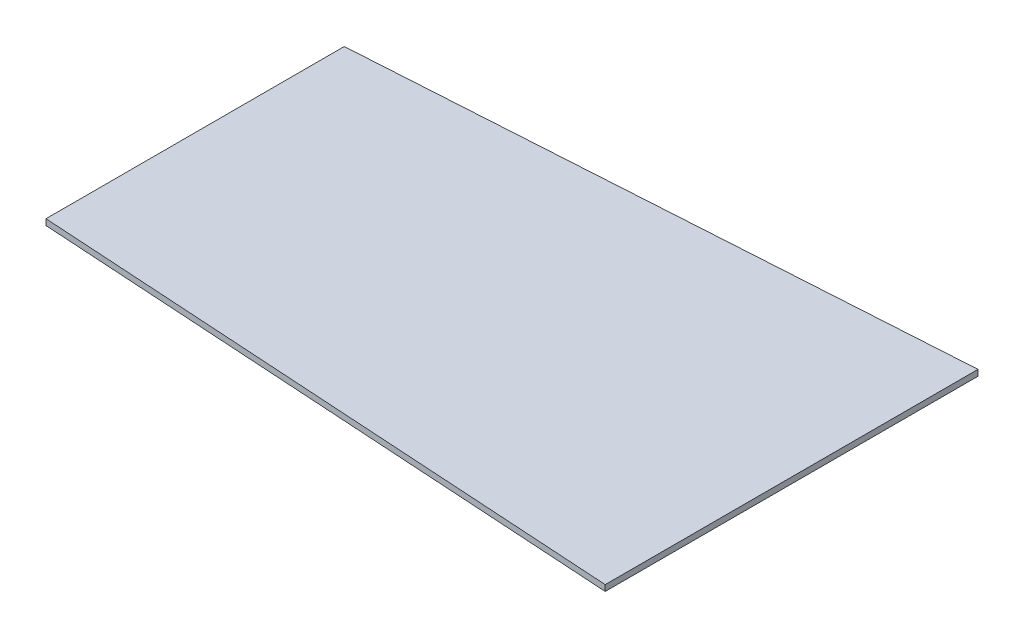
ISO-10303-21;
HEADER;
FILE_DESCRIPTION(('STEP AP214'),'2;1');
FILE_NAME('part.step','',(''),(''),'','','');
FILE_SCHEMA(('AUTOMOTIVE_DESIGN { 1 0 10303 214 1 1 1 1 }'));
ENDSEC;
DATA;
#1=APPLICATION_CONTEXT('core data for automotive mechanical design processes');
#2=APPLICATION_PROTOCOL_DEFINITION('international standard','automotive_design',2000,#1);
#3=PRODUCT_CONTEXT('',#1,'mechanical');
#4=PRODUCT('Part','Part','',(#3));
#5=PRODUCT_RELATED_PRODUCT_CATEGORY('part','',(#4));
#6=PRODUCT_DEFINITION_FORMATION('','',#4);
#7=PRODUCT_DEFINITION_CONTEXT('part definition',#1,'design');
#8=PRODUCT_DEFINITION('design','',#6,#7);
#9=PRODUCT_DEFINITION_SHAPE('','',#8);
#10=(LENGTH_UNIT() NAMED_UNIT(*) SI_UNIT(.MILLI.,.METRE.));
#11=(NAMED_UNIT(*) PLANE_ANGLE_UNIT() SI_UNIT($,.RADIAN.));
#12=(NAMED_UNIT(*) SI_UNIT($,.STERADIAN.) SOLID_ANGLE_UNIT());
#13=UNCERTAINTY_MEASURE_WITH_UNIT(LENGTH_MEASURE(1.E-05),#10,'distance_accuracy_value','');
#14=(GEOMETRIC_REPRESENTATION_CONTEXT(3) GLOBAL_UNCERTAINTY_ASSIGNED_CONTEXT((#13)) GLOBAL_UNIT_ASSIGNED_CONTEXT((#10,
#11,#12)) REPRESENTATION_CONTEXT('',''));
#15=CARTESIAN_POINT('',(0.,0.,0.));
#16=DIRECTION('',(0.,0.,1.));
#17=DIRECTION('',(1.,0.,0.));
#18=AXIS2_PLACEMENT_3D('',#15,#16,#17);
#19=CARTESIAN_POINT('',(25.4,-0.508,-15.875));
#20=DIRECTION('',(1.,0.,0.));
#21=DIRECTION('',(0.,0.,-1.));
#22=AXIS2_PLACEMENT_3D('',#19,#20,#21);
#23=PLANE('',#22);
#24=DIRECTION('',(0.,0.,-1.));
#25=VECTOR('',#24,1.);
#26=CARTESIAN_POINT('',(25.4,0.,-15.875));
#27=LINE('',#26,#25);
#28=CARTESIAN_POINT('',(25.4,0.,15.875));
#29=VERTEX_POINT('',#28);
#30=CARTESIAN_POINT('',(25.4,0.,-15.875));
#31=VERTEX_POINT('',#30);
#32=EDGE_CURVE('E101',#29,#31,#27,.T.);
#33=ORIENTED_EDGE('',*,*,#32,.F.);
#34=DIRECTION('',(0.,1.,0.));
#35=VECTOR('',#34,1.);
#36=CARTESIAN_POINT('',(25.4,-0.508,15.875));
#37=LINE('',#36,#35);
#38=CARTESIAN_POINT('',(25.4,-0.508,15.875));
#39=VERTEX_POINT('',#38);
#40=EDGE_CURVE('E11',#39,#29,#37,.T.);
#41=ORIENTED_EDGE('',*,*,#40,.F.);
#42=DIRECTION('',(0.,0.,-1.));
#43=VECTOR('',#42,1.);
#44=CARTESIAN_POINT('',(25.4,-0.508,-15.875));
#45=LINE('',#44,#43);
#46=CARTESIAN_POINT('',(25.4,-0.508,-15.875));
#47=VERTEX_POINT('',#46);
#48=EDGE_CURVE('E95',#39,#47,#45,.T.);
#49=ORIENTED_EDGE('',*,*,#48,.T.);
#50=DIRECTION('',(0.,1.,0.));
#51=VECTOR('',#50,1.);
#52=CARTESIAN_POINT('',(25.4,-0.508,-15.875));
#53=LINE('',#52,#51);
#54=EDGE_CURVE('E40',#47,#31,#53,.T.);
#55=ORIENTED_EDGE('',*,*,#54,.T.);
#56=EDGE_LOOP('',(#33,#41,#49,#55));
#57=FACE_BOUND('',#56,.T.);
#58=ADVANCED_FACE('F37',(#57),#23,.T.);
#59=CARTESIAN_POINT('',(-25.4,-0.508,12.7));
#60=DIRECTION('',(-0.0623782861551806,0.,0.998052578482889));
#61=DIRECTION('',(0.998052578482889,0.,0.0623782861551805));
#62=AXIS2_PLACEMENT_3D('',#59,#60,#61);
#63=PLANE('',#62);
#64=DIRECTION('',(0.998052578482889,0.,0.0623782861551805));
#65=VECTOR('',#64,1.);
#66=CARTESIAN_POINT('',(-25.4,0.,12.7));
#67=LINE('',#66,#65);
#68=CARTESIAN_POINT('',(-25.4,0.,12.7));
#69=VERTEX_POINT('',#68);
#70=EDGE_CURVE('E97',#69,#29,#67,.T.);
#71=ORIENTED_EDGE('',*,*,#70,.F.);
#72=DIRECTION('',(0.,1.,0.));
#73=VECTOR('',#72,1.);
#74=CARTESIAN_POINT('',(-25.4,-0.508,12.7));
#75=LINE('',#74,#73);
#76=CARTESIAN_POINT('',(-25.4,-0.508,12.7));
#77=VERTEX_POINT('',#76);
#78=EDGE_CURVE('E46',#77,#69,#75,.T.);
#79=ORIENTED_EDGE('',*,*,#78,.F.);
#80=DIRECTION('',(0.998052578482889,0.,0.0623782861551805));
#81=VECTOR('',#80,1.);
#82=CARTESIAN_POINT('',(-25.4,-0.508,12.7));
#83=LINE('',#82,#81);
#84=EDGE_CURVE('E92',#77,#39,#83,.T.);
#85=ORIENTED_EDGE('',*,*,#84,.T.);
#86=ORIENTED_EDGE('',*,*,#40,.T.);
#87=EDGE_LOOP('',(#71,#79,#85,#86));
#88=FACE_BOUND('',#87,.T.);
#89=ADVANCED_FACE('F111',(#88),#63,.T.);
#90=CARTESIAN_POINT('',(-25.4,-0.508,-12.7));
#91=DIRECTION('',(-1.,0.,0.));
#92=DIRECTION('',(0.,0.,1.));
#93=AXIS2_PLACEMENT_3D('',#90,#91,#92);
#94=PLANE('',#93);
#95=DIRECTION('',(0.,0.,1.));
#96=VECTOR('',#95,1.);
#97=CARTESIAN_POINT('',(-25.4,0.,-12.7));
#98=LINE('',#97,#96);
#99=CARTESIAN_POINT('',(-25.4,0.,-12.7));
#100=VERTEX_POINT('',#99);
#101=EDGE_CURVE('E87',#100,#69,#98,.T.);
#102=ORIENTED_EDGE('',*,*,#101,.F.);
#103=DIRECTION('',(0.,1.,0.));
#104=VECTOR('',#103,1.);
#105=CARTESIAN_POINT('',(-25.4,-0.508,-12.7));
#106=LINE('',#105,#104);
#107=CARTESIAN_POINT('',(-25.4,-0.508,-12.7));
#108=VERTEX_POINT('',#107);
#109=EDGE_CURVE('E82',#108,#100,#106,.T.);
#110=ORIENTED_EDGE('',*,*,#109,.F.);
#111=DIRECTION('',(0.,0.,1.));
#112=VECTOR('',#111,1.);
#113=CARTESIAN_POINT('',(-25.4,-0.508,-12.7));
#114=LINE('',#113,#112);
#115=EDGE_CURVE('E85',#108,#77,#114,.T.);
#116=ORIENTED_EDGE('',*,*,#115,.T.);
#117=ORIENTED_EDGE('',*,*,#78,.T.);
#118=EDGE_LOOP('',(#102,#110,#116,#117));
#119=FACE_BOUND('',#118,.T.);
#120=ADVANCED_FACE('F84',(#119),#94,.T.);
#121=CARTESIAN_POINT('',(-25.4,-0.508,-12.7));
#122=DIRECTION('',(-0.0623782861551806,0.,-0.998052578482889));
#123=DIRECTION('',(-0.998052578482889,0.,0.0623782861551805));
#124=AXIS2_PLACEMENT_3D('',#121,#122,#123);
#125=PLANE('',#124);
#126=DIRECTION('',(-0.998052578482889,0.,0.0623782861551805));
#127=VECTOR('',#126,1.);
#128=CARTESIAN_POINT('',(-25.4,0.,-12.7));
#129=LINE('',#128,#127);
#130=EDGE_CURVE('E104',#31,#100,#129,.T.);
#131=ORIENTED_EDGE('',*,*,#130,.F.);
#132=ORIENTED_EDGE('',*,*,#54,.F.);
#133=DIRECTION('',(-0.998052578482889,0.,0.0623782861551805));
#134=VECTOR('',#133,1.);
#135=CARTESIAN_POINT('',(-25.4,-0.508,-12.7));
#136=LINE('',#135,#134);
#137=EDGE_CURVE('E91',#47,#108,#136,.T.);
#138=ORIENTED_EDGE('',*,*,#137,.T.);
#139=ORIENTED_EDGE('',*,*,#109,.T.);
#140=EDGE_LOOP('',(#131,#132,#138,#139));
#141=FACE_BOUND('',#140,.T.);
#142=ADVANCED_FACE('F94',(#141),#125,.T.);
#143=CARTESIAN_POINT('',(0.,-0.508,0.));
#144=DIRECTION('',(0.,1.,0.));
#145=DIRECTION('',(0.,0.,1.));
#146=AXIS2_PLACEMENT_3D('',#143,#144,#145);
#147=PLANE('',#146);
#148=ORIENTED_EDGE('',*,*,#48,.F.);
#149=ORIENTED_EDGE('',*,*,#84,.F.);
#150=ORIENTED_EDGE('',*,*,#115,.F.);
#151=ORIENTED_EDGE('',*,*,#137,.F.);
#152=EDGE_LOOP('',(#148,#149,#150,#151));
#153=FACE_BOUND('',#152,.T.);
#154=ADVANCED_FACE('F90',(#153),#147,.F.);
#155=CARTESIAN_POINT('',(0.,0.,0.));
#156=DIRECTION('',(0.,1.,0.));
#157=DIRECTION('',(0.,0.,1.));
#158=AXIS2_PLACEMENT_3D('',#155,#156,#157);
#159=PLANE('',#158);
#160=ORIENTED_EDGE('',*,*,#32,.T.);
#161=ORIENTED_EDGE('',*,*,#130,.T.);
#162=ORIENTED_EDGE('',*,*,#101,.T.);
#163=ORIENTED_EDGE('',*,*,#70,.T.);
#164=EDGE_LOOP('',(#160,#161,#162,#163));
#165=FACE_BOUND('',#164,.T.);
#166=ADVANCED_FACE('F110',(#165),#159,.T.);
#167=CLOSED_SHELL('',(#58,#89,#120,#142,#154,#166));
#168=MANIFOLD_SOLID_BREP('B2',#167);
#169=ADVANCED_BREP_SHAPE_REPRESENTATION('',(#18,#168),#14);
#170=SHAPE_DEFINITION_REPRESENTATION(#9,#169);
ENDSEC;
END-ISO-10303-21;
